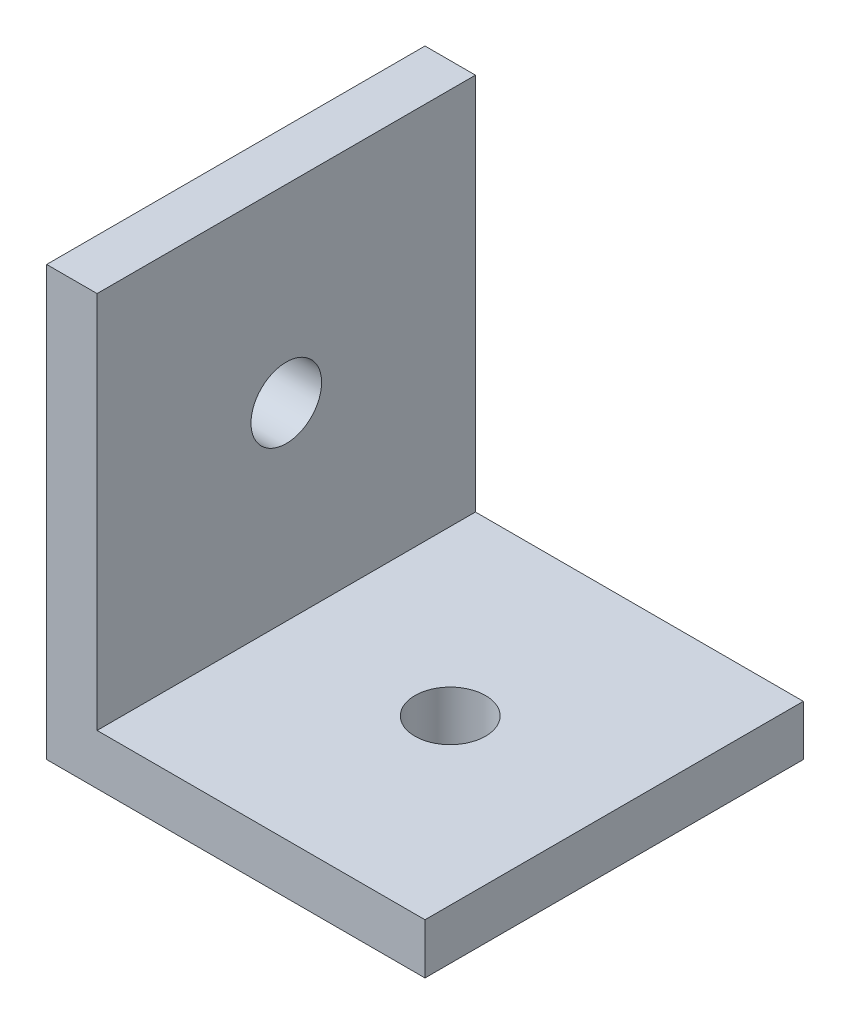
ISO-10303-21;
HEADER;
FILE_DESCRIPTION(('STEP AP214'),'2;1');
FILE_NAME('part.step','',(''),(''),'','','');
FILE_SCHEMA(('AUTOMOTIVE_DESIGN { 1 0 10303 214 1 1 1 1 }'));
ENDSEC;
DATA;
#1=APPLICATION_CONTEXT('core data for automotive mechanical design processes');
#2=APPLICATION_PROTOCOL_DEFINITION('international standard','automotive_design',2000,#1);
#3=PRODUCT_CONTEXT('',#1,'mechanical');
#4=PRODUCT('Part','Part','',(#3));
#5=PRODUCT_RELATED_PRODUCT_CATEGORY('part','',(#4));
#6=PRODUCT_DEFINITION_FORMATION('','',#4);
#7=PRODUCT_DEFINITION_CONTEXT('part definition',#1,'design');
#8=PRODUCT_DEFINITION('design','',#6,#7);
#9=PRODUCT_DEFINITION_SHAPE('','',#8);
#10=(LENGTH_UNIT() NAMED_UNIT(*) SI_UNIT(.MILLI.,.METRE.));
#11=(NAMED_UNIT(*) PLANE_ANGLE_UNIT() SI_UNIT($,.RADIAN.));
#12=(NAMED_UNIT(*) SI_UNIT($,.STERADIAN.) SOLID_ANGLE_UNIT());
#13=UNCERTAINTY_MEASURE_WITH_UNIT(LENGTH_MEASURE(1.E-05),#10,'distance_accuracy_value','');
#14=(GEOMETRIC_REPRESENTATION_CONTEXT(3) GLOBAL_UNCERTAINTY_ASSIGNED_CONTEXT((#13)) GLOBAL_UNIT_ASSIGNED_CONTEXT((#10,
#11,#12)) REPRESENTATION_CONTEXT('',''));
#15=CARTESIAN_POINT('',(0.,0.,0.));
#16=DIRECTION('',(0.,0.,1.));
#17=DIRECTION('',(1.,0.,0.));
#18=AXIS2_PLACEMENT_3D('',#15,#16,#17);
#19=CARTESIAN_POINT('',(-6.02112676056338,2.,-4.11971830985915));
#20=DIRECTION('',(1.,0.,0.));
#21=DIRECTION('',(0.,0.,-1.));
#22=AXIS2_PLACEMENT_3D('',#19,#20,#21);
#23=PLANE('',#22);
#24=CARTESIAN_POINT('',(-6.02112676056337,9.5,3.38028169014085));
#25=DIRECTION('',(1.,0.,0.));
#26=DIRECTION('',(0.,0.,-1.));
#27=AXIS2_PLACEMENT_3D('',#24,#25,#26);
#28=CIRCLE('',#27,1.4);
#29=CARTESIAN_POINT('',(-6.02112676056337,9.5,1.98028169014085));
#30=VERTEX_POINT('',#29);
#31=EDGE_CURVE('E174',#30,#30,#28,.T.);
#32=ORIENTED_EDGE('',*,*,#31,.T.);
#33=EDGE_LOOP('',(#32));
#34=FACE_BOUND('',#33,.T.);
#35=DIRECTION('',(0.,0.,1.));
#36=VECTOR('',#35,1.);
#37=CARTESIAN_POINT('',(-6.02112676056338,0.,-4.11971830985915));
#38=LINE('',#37,#36);
#39=CARTESIAN_POINT('',(-6.02112676056338,0.,-4.11971830985915));
#40=VERTEX_POINT('',#39);
#41=CARTESIAN_POINT('',(-6.02112676056337,0.,10.8802816901408));
#42=VERTEX_POINT('',#41);
#43=EDGE_CURVE('E98',#40,#42,#38,.T.);
#44=ORIENTED_EDGE('',*,*,#43,.T.);
#45=DIRECTION('',(0.,-1.,0.));
#46=VECTOR('',#45,1.);
#47=CARTESIAN_POINT('',(-6.02112676056337,2.,10.8802816901408));
#48=LINE('',#47,#46);
#49=CARTESIAN_POINT('',(-6.02112676056338,17.,10.8802816901408));
#50=VERTEX_POINT('',#49);
#51=EDGE_CURVE('E11',#50,#42,#48,.T.);
#52=ORIENTED_EDGE('',*,*,#51,.F.);
#53=DIRECTION('',(0.,0.,1.));
#54=VECTOR('',#53,1.);
#55=CARTESIAN_POINT('',(-6.02112676056338,17.,-4.11971830985915));
#56=LINE('',#55,#54);
#57=CARTESIAN_POINT('',(-6.02112676056338,17.,-4.11971830985915));
#58=VERTEX_POINT('',#57);
#59=EDGE_CURVE('E99',#58,#50,#56,.T.);
#60=ORIENTED_EDGE('',*,*,#59,.F.);
#61=DIRECTION('',(0.,-1.,0.));
#62=VECTOR('',#61,1.);
#63=CARTESIAN_POINT('',(-6.02112676056338,2.,-4.11971830985915));
#64=LINE('',#63,#62);
#65=EDGE_CURVE('E81',#58,#40,#64,.T.);
#66=ORIENTED_EDGE('',*,*,#65,.T.);
#67=EDGE_LOOP('',(#44,#52,#60,#66));
#68=FACE_BOUND('',#67,.T.);
#69=ADVANCED_FACE('F39',(#34,#68),#23,.F.);
#70=CARTESIAN_POINT('',(-6.02112676056337,2.,10.8802816901408));
#71=DIRECTION('',(0.,0.,-1.));
#72=DIRECTION('',(-1.,0.,0.));
#73=AXIS2_PLACEMENT_3D('',#70,#71,#72);
#74=PLANE('',#73);
#75=DIRECTION('',(1.,0.,0.));
#76=VECTOR('',#75,1.);
#77=CARTESIAN_POINT('',(-6.02112676056337,0.,10.8802816901408));
#78=LINE('',#77,#76);
#79=CARTESIAN_POINT('',(8.97887323943662,0.,10.8802816901408));
#80=VERTEX_POINT('',#79);
#81=EDGE_CURVE('E102',#42,#80,#78,.T.);
#82=ORIENTED_EDGE('',*,*,#81,.T.);
#83=DIRECTION('',(0.,-1.,0.));
#84=VECTOR('',#83,1.);
#85=CARTESIAN_POINT('',(8.97887323943662,2.,10.8802816901408));
#86=LINE('',#85,#84);
#87=CARTESIAN_POINT('',(8.97887323943662,2.,10.8802816901408));
#88=VERTEX_POINT('',#87);
#89=EDGE_CURVE('E50',#88,#80,#86,.T.);
#90=ORIENTED_EDGE('',*,*,#89,.F.);
#91=DIRECTION('',(1.,0.,0.));
#92=VECTOR('',#91,1.);
#93=CARTESIAN_POINT('',(-6.02112676056337,2.,10.8802816901408));
#94=LINE('',#93,#92);
#95=CARTESIAN_POINT('',(-4.02112676056338,2.,10.8802816901408));
#96=VERTEX_POINT('',#95);
#97=EDGE_CURVE('E93',#96,#88,#94,.T.);
#98=ORIENTED_EDGE('',*,*,#97,.F.);
#99=DIRECTION('',(0.,-1.,0.));
#100=VECTOR('',#99,1.);
#101=CARTESIAN_POINT('',(-4.02112676056337,17.,10.8802816901408));
#102=LINE('',#101,#100);
#103=CARTESIAN_POINT('',(-4.02112676056337,17.,10.8802816901408));
#104=VERTEX_POINT('',#103);
#105=EDGE_CURVE('E104',#104,#96,#102,.T.);
#106=ORIENTED_EDGE('',*,*,#105,.F.);
#107=DIRECTION('',(1.,0.,0.));
#108=VECTOR('',#107,1.);
#109=CARTESIAN_POINT('',(-6.02112676056338,17.,10.8802816901408));
#110=LINE('',#109,#108);
#111=EDGE_CURVE('E127',#50,#104,#110,.T.);
#112=ORIENTED_EDGE('',*,*,#111,.F.);
#113=ORIENTED_EDGE('',*,*,#51,.T.);
#114=EDGE_LOOP('',(#82,#90,#98,#106,#112,#113));
#115=FACE_BOUND('',#114,.T.);
#116=ADVANCED_FACE('F122',(#115),#74,.F.);
#117=CARTESIAN_POINT('',(8.97887323943662,2.,-4.11971830985915));
#118=DIRECTION('',(-1.,0.,0.));
#119=DIRECTION('',(0.,0.,1.));
#120=AXIS2_PLACEMENT_3D('',#117,#118,#119);
#121=PLANE('',#120);
#122=DIRECTION('',(0.,0.,-1.));
#123=VECTOR('',#122,1.);
#124=CARTESIAN_POINT('',(8.97887323943662,0.,-4.11971830985915));
#125=LINE('',#124,#123);
#126=CARTESIAN_POINT('',(8.97887323943662,0.,-4.11971830985915));
#127=VERTEX_POINT('',#126);
#128=EDGE_CURVE('E95',#80,#127,#125,.T.);
#129=ORIENTED_EDGE('',*,*,#128,.T.);
#130=DIRECTION('',(0.,-1.,0.));
#131=VECTOR('',#130,1.);
#132=CARTESIAN_POINT('',(8.97887323943662,2.,-4.11971830985915));
#133=LINE('',#132,#131);
#134=CARTESIAN_POINT('',(8.97887323943662,2.,-4.11971830985915));
#135=VERTEX_POINT('',#134);
#136=EDGE_CURVE('E87',#135,#127,#133,.T.);
#137=ORIENTED_EDGE('',*,*,#136,.F.);
#138=DIRECTION('',(0.,0.,-1.));
#139=VECTOR('',#138,1.);
#140=CARTESIAN_POINT('',(8.97887323943662,2.,-4.11971830985915));
#141=LINE('',#140,#139);
#142=EDGE_CURVE('E58',#88,#135,#141,.T.);
#143=ORIENTED_EDGE('',*,*,#142,.F.);
#144=ORIENTED_EDGE('',*,*,#89,.T.);
#145=EDGE_LOOP('',(#129,#137,#143,#144));
#146=FACE_BOUND('',#145,.T.);
#147=ADVANCED_FACE('F116',(#146),#121,.F.);
#148=CARTESIAN_POINT('',(-6.02112676056338,2.,-4.11971830985915));
#149=DIRECTION('',(0.,0.,1.));
#150=DIRECTION('',(1.,0.,0.));
#151=AXIS2_PLACEMENT_3D('',#148,#149,#150);
#152=PLANE('',#151);
#153=DIRECTION('',(-1.,0.,0.));
#154=VECTOR('',#153,1.);
#155=CARTESIAN_POINT('',(-6.02112676056338,0.,-4.11971830985915));
#156=LINE('',#155,#154);
#157=EDGE_CURVE('E78',#127,#40,#156,.T.);
#158=ORIENTED_EDGE('',*,*,#157,.T.);
#159=ORIENTED_EDGE('',*,*,#65,.F.);
#160=DIRECTION('',(-1.,0.,0.));
#161=VECTOR('',#160,1.);
#162=CARTESIAN_POINT('',(-6.02112676056338,17.,-4.11971830985915));
#163=LINE('',#162,#161);
#164=CARTESIAN_POINT('',(-4.02112676056338,17.,-4.11971830985915));
#165=VERTEX_POINT('',#164);
#166=EDGE_CURVE('E138',#165,#58,#163,.T.);
#167=ORIENTED_EDGE('',*,*,#166,.F.);
#168=DIRECTION('',(0.,-1.,0.));
#169=VECTOR('',#168,1.);
#170=CARTESIAN_POINT('',(-4.02112676056338,17.,-4.11971830985915));
#171=LINE('',#170,#169);
#172=CARTESIAN_POINT('',(-4.02112676056338,2.,-4.11971830985915));
#173=VERTEX_POINT('',#172);
#174=EDGE_CURVE('E108',#165,#173,#171,.T.);
#175=ORIENTED_EDGE('',*,*,#174,.T.);
#176=DIRECTION('',(-1.,0.,0.));
#177=VECTOR('',#176,1.);
#178=CARTESIAN_POINT('',(-6.02112676056338,2.,-4.11971830985915));
#179=LINE('',#178,#177);
#180=EDGE_CURVE('E101',#135,#173,#179,.T.);
#181=ORIENTED_EDGE('',*,*,#180,.F.);
#182=ORIENTED_EDGE('',*,*,#136,.T.);
#183=EDGE_LOOP('',(#158,#159,#167,#175,#181,#182));
#184=FACE_BOUND('',#183,.T.);
#185=ADVANCED_FACE('F84',(#184),#152,.F.);
#186=CARTESIAN_POINT('',(0.,2.,0.));
#187=DIRECTION('',(0.,1.,0.));
#188=DIRECTION('',(0.,0.,1.));
#189=AXIS2_PLACEMENT_3D('',#186,#187,#188);
#190=PLANE('',#189);
#191=CARTESIAN_POINT('',(2.47887323943665,2.,3.38028169014085));
#192=DIRECTION('',(0.,1.,0.));
#193=DIRECTION('',(0.,0.,1.));
#194=AXIS2_PLACEMENT_3D('',#191,#192,#193);
#195=CIRCLE('',#194,1.4);
#196=CARTESIAN_POINT('',(2.47887323943665,2.,4.78028169014085));
#197=VERTEX_POINT('',#196);
#198=EDGE_CURVE('E173',#197,#197,#195,.T.);
#199=ORIENTED_EDGE('',*,*,#198,.F.);
#200=EDGE_LOOP('',(#199));
#201=FACE_BOUND('',#200,.T.);
#202=DIRECTION('',(0.,0.,-1.));
#203=VECTOR('',#202,1.);
#204=CARTESIAN_POINT('',(-4.02112676056338,2.,-4.11971830985915));
#205=LINE('',#204,#203);
#206=EDGE_CURVE('E53',#96,#173,#205,.T.);
#207=ORIENTED_EDGE('',*,*,#206,.F.);
#208=ORIENTED_EDGE('',*,*,#97,.T.);
#209=ORIENTED_EDGE('',*,*,#142,.T.);
#210=ORIENTED_EDGE('',*,*,#180,.T.);
#211=EDGE_LOOP('',(#207,#208,#209,#210));
#212=FACE_BOUND('',#211,.T.);
#213=ADVANCED_FACE('F147',(#201,#212),#190,.T.);
#214=CARTESIAN_POINT('',(0.,0.,0.));
#215=DIRECTION('',(0.,1.,0.));
#216=DIRECTION('',(0.,0.,1.));
#217=AXIS2_PLACEMENT_3D('',#214,#215,#216);
#218=PLANE('',#217);
#219=CARTESIAN_POINT('',(2.47887323943665,0.,3.38028169014085));
#220=DIRECTION('',(0.,1.,0.));
#221=DIRECTION('',(0.,0.,1.));
#222=AXIS2_PLACEMENT_3D('',#219,#220,#221);
#223=CIRCLE('',#222,1.4);
#224=CARTESIAN_POINT('',(2.47887323943665,0.,4.78028169014085));
#225=VERTEX_POINT('',#224);
#226=EDGE_CURVE('E45',#225,#225,#223,.T.);
#227=ORIENTED_EDGE('',*,*,#226,.T.);
#228=EDGE_LOOP('',(#227));
#229=FACE_BOUND('',#228,.T.);
#230=ORIENTED_EDGE('',*,*,#43,.F.);
#231=ORIENTED_EDGE('',*,*,#157,.F.);
#232=ORIENTED_EDGE('',*,*,#128,.F.);
#233=ORIENTED_EDGE('',*,*,#81,.F.);
#234=EDGE_LOOP('',(#230,#231,#232,#233));
#235=FACE_BOUND('',#234,.T.);
#236=ADVANCED_FACE('F103',(#229,#235),#218,.F.);
#237=CARTESIAN_POINT('',(-4.02112676056338,17.,-4.11971830985915));
#238=DIRECTION('',(-1.,0.,0.));
#239=DIRECTION('',(0.,0.,1.));
#240=AXIS2_PLACEMENT_3D('',#237,#238,#239);
#241=PLANE('',#240);
#242=CARTESIAN_POINT('',(-4.02112676056337,9.5,3.38028169014085));
#243=DIRECTION('',(1.,0.,0.));
#244=DIRECTION('',(0.,0.,-1.));
#245=AXIS2_PLACEMENT_3D('',#242,#243,#244);
#246=CIRCLE('',#245,1.4);
#247=CARTESIAN_POINT('',(-4.02112676056337,9.5,1.98028169014085));
#248=VERTEX_POINT('',#247);
#249=EDGE_CURVE('E177',#248,#248,#246,.T.);
#250=ORIENTED_EDGE('',*,*,#249,.F.);
#251=EDGE_LOOP('',(#250));
#252=FACE_BOUND('',#251,.T.);
#253=ORIENTED_EDGE('',*,*,#206,.T.);
#254=ORIENTED_EDGE('',*,*,#174,.F.);
#255=DIRECTION('',(0.,0.,-1.));
#256=VECTOR('',#255,1.);
#257=CARTESIAN_POINT('',(-4.02112676056338,17.,-4.11971830985915));
#258=LINE('',#257,#256);
#259=EDGE_CURVE('E139',#104,#165,#258,.T.);
#260=ORIENTED_EDGE('',*,*,#259,.F.);
#261=ORIENTED_EDGE('',*,*,#105,.T.);
#262=EDGE_LOOP('',(#253,#254,#260,#261));
#263=FACE_BOUND('',#262,.T.);
#264=ADVANCED_FACE('F145',(#252,#263),#241,.F.);
#265=CARTESIAN_POINT('',(0.,17.,0.));
#266=DIRECTION('',(0.,1.,0.));
#267=DIRECTION('',(0.,0.,1.));
#268=AXIS2_PLACEMENT_3D('',#265,#266,#267);
#269=PLANE('',#268);
#270=ORIENTED_EDGE('',*,*,#59,.T.);
#271=ORIENTED_EDGE('',*,*,#111,.T.);
#272=ORIENTED_EDGE('',*,*,#259,.T.);
#273=ORIENTED_EDGE('',*,*,#166,.T.);
#274=EDGE_LOOP('',(#270,#271,#272,#273));
#275=FACE_BOUND('',#274,.T.);
#276=ADVANCED_FACE('F136',(#275),#269,.T.);
#277=CARTESIAN_POINT('',(2.47887323943665,-13.,3.38028169014085));
#278=DIRECTION('',(0.,1.,0.));
#279=DIRECTION('',(0.,0.,1.));
#280=AXIS2_PLACEMENT_3D('',#277,#278,#279);
#281=CYLINDRICAL_SURFACE('',#280,1.4);
#282=ORIENTED_EDGE('',*,*,#198,.T.);
#283=EDGE_LOOP('',(#282));
#284=FACE_BOUND('',#283,.T.);
#285=ORIENTED_EDGE('',*,*,#226,.F.);
#286=EDGE_LOOP('',(#285));
#287=FACE_BOUND('',#286,.T.);
#288=ADVANCED_FACE('F188',(#284,#287),#281,.F.);
#289=CARTESIAN_POINT('',(-19.0211267605634,9.5,3.38028169014085));
#290=DIRECTION('',(1.,0.,0.));
#291=DIRECTION('',(0.,0.,-1.));
#292=AXIS2_PLACEMENT_3D('',#289,#290,#291);
#293=CYLINDRICAL_SURFACE('',#292,1.4);
#294=ORIENTED_EDGE('',*,*,#249,.T.);
#295=EDGE_LOOP('',(#294));
#296=FACE_BOUND('',#295,.T.);
#297=ORIENTED_EDGE('',*,*,#31,.F.);
#298=EDGE_LOOP('',(#297));
#299=FACE_BOUND('',#298,.T.);
#300=ADVANCED_FACE('F183',(#296,#299),#293,.F.);
#301=CLOSED_SHELL('',(#69,#116,#147,#185,#213,#236,#264,#276,#288,#300));
#302=MANIFOLD_SOLID_BREP('B2',#301);
#303=ADVANCED_BREP_SHAPE_REPRESENTATION('',(#18,#302),#14);
#304=SHAPE_DEFINITION_REPRESENTATION(#9,#303);
ENDSEC;
END-ISO-10303-21;
